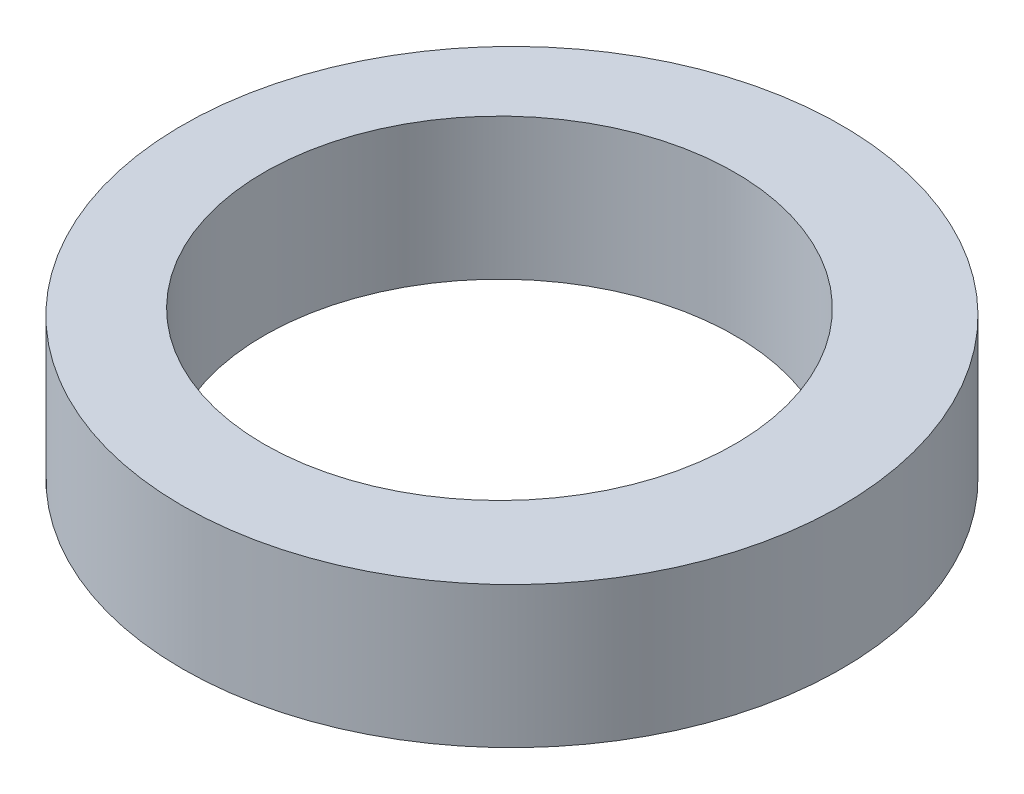
ISO-10303-21;
HEADER;
FILE_DESCRIPTION(('STEP AP214'),'2;1');
FILE_NAME('part.step','',(''),(''),'','','');
FILE_SCHEMA(('AUTOMOTIVE_DESIGN { 1 0 10303 214 1 1 1 1 }'));
ENDSEC;
DATA;
#1=APPLICATION_CONTEXT('core data for automotive mechanical design processes');
#2=APPLICATION_PROTOCOL_DEFINITION('international standard','automotive_design',2000,#1);
#3=PRODUCT_CONTEXT('',#1,'mechanical');
#4=PRODUCT('Part','Part','',(#3));
#5=PRODUCT_RELATED_PRODUCT_CATEGORY('part','',(#4));
#6=PRODUCT_DEFINITION_FORMATION('','',#4);
#7=PRODUCT_DEFINITION_CONTEXT('part definition',#1,'design');
#8=PRODUCT_DEFINITION('design','',#6,#7);
#9=PRODUCT_DEFINITION_SHAPE('','',#8);
#10=(LENGTH_UNIT() NAMED_UNIT(*) SI_UNIT(.MILLI.,.METRE.));
#11=(NAMED_UNIT(*) PLANE_ANGLE_UNIT() SI_UNIT($,.RADIAN.));
#12=(NAMED_UNIT(*) SI_UNIT($,.STERADIAN.) SOLID_ANGLE_UNIT());
#13=UNCERTAINTY_MEASURE_WITH_UNIT(LENGTH_MEASURE(1.E-05),#10,'distance_accuracy_value','');
#14=(GEOMETRIC_REPRESENTATION_CONTEXT(3) GLOBAL_UNCERTAINTY_ASSIGNED_CONTEXT((#13)) GLOBAL_UNIT_ASSIGNED_CONTEXT((#10,
#11,#12)) REPRESENTATION_CONTEXT('',''));
#15=CARTESIAN_POINT('',(0.,0.,0.));
#16=DIRECTION('',(0.,0.,1.));
#17=DIRECTION('',(1.,0.,0.));
#18=AXIS2_PLACEMENT_3D('',#15,#16,#17);
#19=CARTESIAN_POINT('',(0.661647636762609,7.5,0.));
#20=DIRECTION('',(0.,1.,0.));
#21=DIRECTION('',(0.,0.,1.));
#22=AXIS2_PLACEMENT_3D('',#19,#20,#21);
#23=PLANE('',#22);
#24=CARTESIAN_POINT('',(0.661647636762609,7.5,0.));
#25=DIRECTION('',(0.,1.,0.));
#26=DIRECTION('',(0.,0.,1.));
#27=AXIS2_PLACEMENT_3D('',#24,#25,#26);
#28=CIRCLE('',#27,17.5);
#29=CARTESIAN_POINT('',(0.661647636762609,7.5,17.5));
#30=VERTEX_POINT('',#29);
#31=EDGE_CURVE('E10',#30,#30,#28,.T.);
#32=ORIENTED_EDGE('',*,*,#31,.T.);
#33=EDGE_LOOP('',(#32));
#34=FACE_BOUND('',#33,.T.);
#35=CARTESIAN_POINT('',(0.,7.5,0.));
#36=DIRECTION('',(0.,1.,0.));
#37=DIRECTION('',(0.,0.,1.));
#38=AXIS2_PLACEMENT_3D('',#35,#36,#37);
#39=CIRCLE('',#38,12.5);
#40=CARTESIAN_POINT('',(0.,7.5,12.5));
#41=VERTEX_POINT('',#40);
#42=EDGE_CURVE('E44',#41,#41,#39,.T.);
#43=ORIENTED_EDGE('',*,*,#42,.F.);
#44=EDGE_LOOP('',(#43));
#45=FACE_BOUND('',#44,.T.);
#46=ADVANCED_FACE('F33',(#34,#45),#23,.T.);
#47=CARTESIAN_POINT('',(0.661647636762609,0.,0.));
#48=DIRECTION('',(0.,1.,0.));
#49=DIRECTION('',(0.,0.,1.));
#50=AXIS2_PLACEMENT_3D('',#47,#48,#49);
#51=PLANE('',#50);
#52=CARTESIAN_POINT('',(0.661647636762609,0.,0.));
#53=DIRECTION('',(0.,1.,0.));
#54=DIRECTION('',(0.,0.,1.));
#55=AXIS2_PLACEMENT_3D('',#52,#53,#54);
#56=CIRCLE('',#55,17.5);
#57=CARTESIAN_POINT('',(0.661647636762609,0.,17.5));
#58=VERTEX_POINT('',#57);
#59=EDGE_CURVE('E37',#58,#58,#56,.T.);
#60=ORIENTED_EDGE('',*,*,#59,.F.);
#61=EDGE_LOOP('',(#60));
#62=FACE_BOUND('',#61,.T.);
#63=CARTESIAN_POINT('',(0.,0.,0.));
#64=DIRECTION('',(0.,1.,0.));
#65=DIRECTION('',(0.,0.,1.));
#66=AXIS2_PLACEMENT_3D('',#63,#64,#65);
#67=CIRCLE('',#66,12.5);
#68=CARTESIAN_POINT('',(0.,0.,12.5));
#69=VERTEX_POINT('',#68);
#70=EDGE_CURVE('E46',#69,#69,#67,.T.);
#71=ORIENTED_EDGE('',*,*,#70,.T.);
#72=EDGE_LOOP('',(#71));
#73=FACE_BOUND('',#72,.T.);
#74=ADVANCED_FACE('F56',(#62,#73),#51,.F.);
#75=CARTESIAN_POINT('',(0.661647636762609,7.5,0.));
#76=DIRECTION('',(0.,-1.,0.));
#77=DIRECTION('',(0.,0.,-1.));
#78=AXIS2_PLACEMENT_3D('',#75,#76,#77);
#79=CYLINDRICAL_SURFACE('',#78,17.5);
#80=ORIENTED_EDGE('',*,*,#31,.F.);
#81=EDGE_LOOP('',(#80));
#82=FACE_BOUND('',#81,.T.);
#83=ORIENTED_EDGE('',*,*,#59,.T.);
#84=EDGE_LOOP('',(#83));
#85=FACE_BOUND('',#84,.T.);
#86=ADVANCED_FACE('F35',(#82,#85),#79,.T.);
#87=CARTESIAN_POINT('',(0.,7.5,0.));
#88=DIRECTION('',(0.,-1.,0.));
#89=DIRECTION('',(0.,0.,-1.));
#90=AXIS2_PLACEMENT_3D('',#87,#88,#89);
#91=CYLINDRICAL_SURFACE('',#90,12.5);
#92=ORIENTED_EDGE('',*,*,#42,.T.);
#93=EDGE_LOOP('',(#92));
#94=FACE_BOUND('',#93,.T.);
#95=ORIENTED_EDGE('',*,*,#70,.F.);
#96=EDGE_LOOP('',(#95));
#97=FACE_BOUND('',#96,.T.);
#98=ADVANCED_FACE('F52',(#94,#97),#91,.F.);
#99=CLOSED_SHELL('',(#46,#74,#86,#98));
#100=MANIFOLD_SOLID_BREP('B2',#99);
#101=ADVANCED_BREP_SHAPE_REPRESENTATION('',(#18,#100),#14);
#102=SHAPE_DEFINITION_REPRESENTATION(#9,#101);
ENDSEC;
END-ISO-10303-21;
